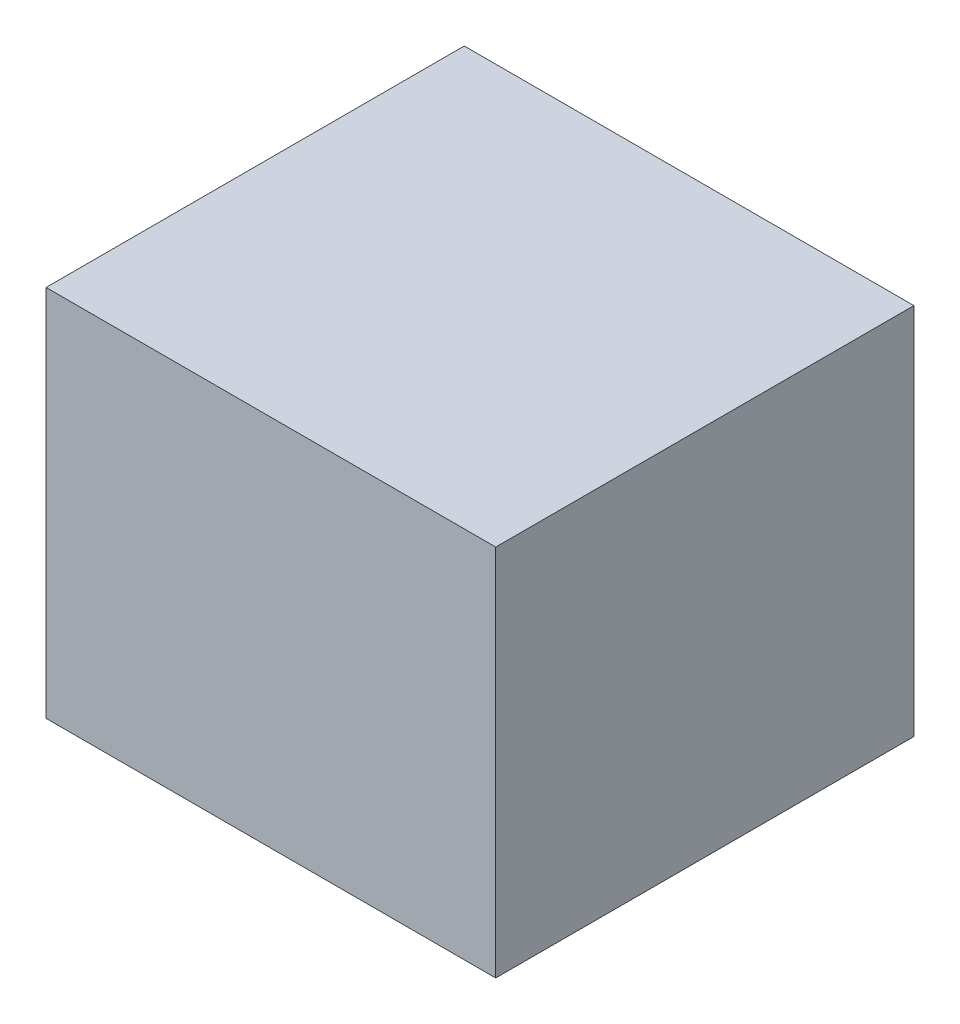
ISO-10303-21;
HEADER;
FILE_DESCRIPTION(('STEP AP214'),'2;1');
FILE_NAME('part.step','',(''),(''),'','','');
FILE_SCHEMA(('AUTOMOTIVE_DESIGN { 1 0 10303 214 1 1 1 1 }'));
ENDSEC;
DATA;
#1=APPLICATION_CONTEXT('core data for automotive mechanical design processes');
#2=APPLICATION_PROTOCOL_DEFINITION('international standard','automotive_design',2000,#1);
#3=PRODUCT_CONTEXT('',#1,'mechanical');
#4=PRODUCT('Part','Part','',(#3));
#5=PRODUCT_RELATED_PRODUCT_CATEGORY('part','',(#4));
#6=PRODUCT_DEFINITION_FORMATION('','',#4);
#7=PRODUCT_DEFINITION_CONTEXT('part definition',#1,'design');
#8=PRODUCT_DEFINITION('design','',#6,#7);
#9=PRODUCT_DEFINITION_SHAPE('','',#8);
#10=(LENGTH_UNIT() NAMED_UNIT(*) SI_UNIT(.MILLI.,.METRE.));
#11=(NAMED_UNIT(*) PLANE_ANGLE_UNIT() SI_UNIT($,.RADIAN.));
#12=(NAMED_UNIT(*) SI_UNIT($,.STERADIAN.) SOLID_ANGLE_UNIT());
#13=UNCERTAINTY_MEASURE_WITH_UNIT(LENGTH_MEASURE(1.E-05),#10,'distance_accuracy_value','');
#14=(GEOMETRIC_REPRESENTATION_CONTEXT(3) GLOBAL_UNCERTAINTY_ASSIGNED_CONTEXT((#13)) GLOBAL_UNIT_ASSIGNED_CONTEXT((#10,
#11,#12)) REPRESENTATION_CONTEXT('',''));
#15=CARTESIAN_POINT('',(0.,0.,0.));
#16=DIRECTION('',(0.,0.,1.));
#17=DIRECTION('',(1.,0.,0.));
#18=AXIS2_PLACEMENT_3D('',#15,#16,#17);
#19=CARTESIAN_POINT('',(99.,-38.5,45.));
#20=DIRECTION('',(0.,1.,0.));
#21=DIRECTION('',(0.,0.,1.));
#22=AXIS2_PLACEMENT_3D('',#19,#20,#21);
#23=PLANE('',#22);
#24=DIRECTION('',(0.,0.,-1.));
#25=VECTOR('',#24,1.);
#26=CARTESIAN_POINT('',(35.5,-38.5,45.));
#27=LINE('',#26,#25);
#28=CARTESIAN_POINT('',(35.5,-38.5,43.5));
#29=VERTEX_POINT('',#28);
#30=CARTESIAN_POINT('',(35.5,-38.5,7.50000000000001));
#31=VERTEX_POINT('',#30);
#32=EDGE_CURVE('E403',#29,#31,#27,.T.);
#33=ORIENTED_EDGE('',*,*,#32,.T.);
#34=DIRECTION('',(0.,0.,-1.));
#35=VECTOR('',#34,1.);
#36=CARTESIAN_POINT('',(35.5,-38.5,45.));
#37=LINE('',#36,#35);
#38=CARTESIAN_POINT('',(35.5,-38.5,-10.5));
#39=VERTEX_POINT('',#38);
#40=EDGE_CURVE('E239',#31,#39,#37,.T.);
#41=ORIENTED_EDGE('',*,*,#40,.T.);
#42=CARTESIAN_POINT('',(35.5,-38.5,-43.5));
#43=VERTEX_POINT('',#42);
#44=EDGE_CURVE('E402',#39,#43,#27,.T.);
#45=ORIENTED_EDGE('',*,*,#44,.T.);
#46=DIRECTION('',(-1.,0.,0.));
#47=VECTOR('',#46,1.);
#48=CARTESIAN_POINT('',(99.,-38.5,-43.5));
#49=LINE('',#48,#47);
#50=CARTESIAN_POINT('',(9.99999999999999,-38.5,-43.5));
#51=VERTEX_POINT('',#50);
#52=EDGE_CURVE('E342',#43,#51,#49,.T.);
#53=ORIENTED_EDGE('',*,*,#52,.T.);
#54=DIRECTION('',(0.,0.,-1.));
#55=VECTOR('',#54,1.);
#56=CARTESIAN_POINT('',(9.99999999999999,-38.5,45.));
#57=LINE('',#56,#55);
#58=CARTESIAN_POINT('',(9.99999999999999,-38.5,43.5));
#59=VERTEX_POINT('',#58);
#60=EDGE_CURVE('E397',#59,#51,#57,.T.);
#61=ORIENTED_EDGE('',*,*,#60,.F.);
#62=DIRECTION('',(-1.,0.,0.));
#63=VECTOR('',#62,1.);
#64=CARTESIAN_POINT('',(99.,-38.5,43.5));
#65=LINE('',#64,#63);
#66=EDGE_CURVE('E346',#29,#59,#65,.T.);
#67=ORIENTED_EDGE('',*,*,#66,.F.);
#68=EDGE_LOOP('',(#33,#41,#45,#53,#61,#67));
#69=FACE_BOUND('',#68,.T.);
#70=ADVANCED_FACE('F37',(#69),#23,.T.);
#71=CARTESIAN_POINT('',(37.5,-40.,43.5));
#72=DIRECTION('',(1.,0.,0.));
#73=DIRECTION('',(0.,0.,-1.));
#74=AXIS2_PLACEMENT_3D('',#71,#72,#73);
#75=PLANE('',#74);
#76=DIRECTION('',(0.,0.,-1.));
#77=VECTOR('',#76,1.);
#78=CARTESIAN_POINT('',(37.5,-38.5,45.));
#79=LINE('',#78,#77);
#80=CARTESIAN_POINT('',(37.5,-38.5,43.5));
#81=VERTEX_POINT('',#80);
#82=CARTESIAN_POINT('',(37.5,-38.5,7.5));
#83=VERTEX_POINT('',#82);
#84=EDGE_CURVE('E400',#81,#83,#79,.T.);
#85=ORIENTED_EDGE('',*,*,#84,.T.);
#86=DIRECTION('',(0.,1.,0.));
#87=VECTOR('',#86,1.);
#88=CARTESIAN_POINT('',(37.5,-40.,7.50000000000001));
#89=LINE('',#88,#87);
#90=CARTESIAN_POINT('',(37.5,38.5,7.50000000000001));
#91=VERTEX_POINT('',#90);
#92=EDGE_CURVE('E60',#83,#91,#89,.T.);
#93=ORIENTED_EDGE('',*,*,#92,.T.);
#94=DIRECTION('',(0.,0.,1.));
#95=VECTOR('',#94,1.);
#96=CARTESIAN_POINT('',(37.5,38.5,45.));
#97=LINE('',#96,#95);
#98=CARTESIAN_POINT('',(37.5,38.5,43.5));
#99=VERTEX_POINT('',#98);
#100=EDGE_CURVE('E255',#91,#99,#97,.T.);
#101=ORIENTED_EDGE('',*,*,#100,.T.);
#102=DIRECTION('',(0.,1.,0.));
#103=VECTOR('',#102,1.);
#104=CARTESIAN_POINT('',(37.5,-40.,43.5));
#105=LINE('',#104,#103);
#106=EDGE_CURVE('E251',#81,#99,#105,.T.);
#107=ORIENTED_EDGE('',*,*,#106,.F.);
#108=EDGE_LOOP('',(#85,#93,#101,#107));
#109=FACE_BOUND('',#108,.T.);
#110=ADVANCED_FACE('F459',(#109),#75,.T.);
#111=CARTESIAN_POINT('',(35.5,-40.,43.5));
#112=DIRECTION('',(1.,0.,0.));
#113=DIRECTION('',(0.,0.,-1.));
#114=AXIS2_PLACEMENT_3D('',#111,#112,#113);
#115=PLANE('',#114);
#116=DIRECTION('',(0.,1.,0.));
#117=VECTOR('',#116,1.);
#118=CARTESIAN_POINT('',(35.5,-40.,7.50000000000001));
#119=LINE('',#118,#117);
#120=CARTESIAN_POINT('',(35.5,38.5,7.50000000000001));
#121=VERTEX_POINT('',#120);
#122=EDGE_CURVE('E45',#31,#121,#119,.T.);
#123=ORIENTED_EDGE('',*,*,#122,.F.);
#124=ORIENTED_EDGE('',*,*,#32,.F.);
#125=DIRECTION('',(0.,1.,0.));
#126=VECTOR('',#125,1.);
#127=CARTESIAN_POINT('',(35.5,-40.,43.5));
#128=LINE('',#127,#126);
#129=CARTESIAN_POINT('',(35.5,38.5,43.5));
#130=VERTEX_POINT('',#129);
#131=EDGE_CURVE('E252',#29,#130,#128,.T.);
#132=ORIENTED_EDGE('',*,*,#131,.T.);
#133=DIRECTION('',(0.,0.,1.));
#134=VECTOR('',#133,1.);
#135=CARTESIAN_POINT('',(35.5,38.5,45.));
#136=LINE('',#135,#134);
#137=EDGE_CURVE('E267',#121,#130,#136,.T.);
#138=ORIENTED_EDGE('',*,*,#137,.F.);
#139=EDGE_LOOP('',(#123,#124,#132,#138));
#140=FACE_BOUND('',#139,.T.);
#141=ADVANCED_FACE('F413',(#140),#115,.F.);
#142=CARTESIAN_POINT('',(99.,40.,-43.5));
#143=DIRECTION('',(0.,0.,1.));
#144=DIRECTION('',(0.,-1.,0.));
#145=AXIS2_PLACEMENT_3D('',#142,#143,#144);
#146=PLANE('',#145);
#147=ORIENTED_EDGE('',*,*,#52,.F.);
#148=DIRECTION('',(0.,1.,0.));
#149=VECTOR('',#148,1.);
#150=CARTESIAN_POINT('',(35.5,-40.,-43.5));
#151=LINE('',#150,#149);
#152=CARTESIAN_POINT('',(35.5,38.5,-43.5));
#153=VERTEX_POINT('',#152);
#154=EDGE_CURVE('E256',#43,#153,#151,.T.);
#155=ORIENTED_EDGE('',*,*,#154,.T.);
#156=DIRECTION('',(-1.,0.,0.));
#157=VECTOR('',#156,1.);
#158=CARTESIAN_POINT('',(99.,38.5,-43.5));
#159=LINE('',#158,#157);
#160=CARTESIAN_POINT('',(9.99999999999999,38.5,-43.5));
#161=VERTEX_POINT('',#160);
#162=EDGE_CURVE('E354',#153,#161,#159,.T.);
#163=ORIENTED_EDGE('',*,*,#162,.T.);
#164=DIRECTION('',(0.,1.,0.));
#165=VECTOR('',#164,1.);
#166=CARTESIAN_POINT('',(9.99999999999999,40.,-43.5));
#167=LINE('',#166,#165);
#168=EDGE_CURVE('E307',#51,#161,#167,.T.);
#169=ORIENTED_EDGE('',*,*,#168,.F.);
#170=EDGE_LOOP('',(#147,#155,#163,#169));
#171=FACE_BOUND('',#170,.T.);
#172=ADVANCED_FACE('F430',(#171),#146,.T.);
#173=CARTESIAN_POINT('',(99.,40.,43.5));
#174=DIRECTION('',(0.,0.,-1.));
#175=DIRECTION('',(0.,1.,0.));
#176=AXIS2_PLACEMENT_3D('',#173,#174,#175);
#177=PLANE('',#176);
#178=DIRECTION('',(-1.,0.,0.));
#179=VECTOR('',#178,1.);
#180=CARTESIAN_POINT('',(99.,38.5,43.5));
#181=LINE('',#180,#179);
#182=CARTESIAN_POINT('',(9.99999999999999,38.5,43.5));
#183=VERTEX_POINT('',#182);
#184=EDGE_CURVE('E350',#130,#183,#181,.T.);
#185=ORIENTED_EDGE('',*,*,#184,.F.);
#186=ORIENTED_EDGE('',*,*,#131,.F.);
#187=ORIENTED_EDGE('',*,*,#66,.T.);
#188=DIRECTION('',(0.,-1.,0.));
#189=VECTOR('',#188,1.);
#190=CARTESIAN_POINT('',(9.99999999999999,40.,43.5));
#191=LINE('',#190,#189);
#192=EDGE_CURVE('E302',#183,#59,#191,.T.);
#193=ORIENTED_EDGE('',*,*,#192,.F.);
#194=EDGE_LOOP('',(#185,#186,#187,#193));
#195=FACE_BOUND('',#194,.T.);
#196=ADVANCED_FACE('F419',(#195),#177,.T.);
#197=CARTESIAN_POINT('',(0.,0.,0.));
#198=DIRECTION('',(1.,0.,0.));
#199=DIRECTION('',(0.,0.,-1.));
#200=AXIS2_PLACEMENT_3D('',#197,#198,#199);
#201=PLANE('',#200);
#202=DIRECTION('',(0.,1.,0.));
#203=VECTOR('',#202,1.);
#204=CARTESIAN_POINT('',(0.,40.,-46.5));
#205=LINE('',#204,#203);
#206=CARTESIAN_POINT('',(0.,-41.5,-46.5));
#207=VERTEX_POINT('',#206);
#208=CARTESIAN_POINT('',(0.,41.5,-46.5));
#209=VERTEX_POINT('',#208);
#210=EDGE_CURVE('E358',#207,#209,#205,.T.);
#211=ORIENTED_EDGE('',*,*,#210,.F.);
#212=DIRECTION('',(0.,0.,-1.));
#213=VECTOR('',#212,1.);
#214=CARTESIAN_POINT('',(0.,-41.5,45.));
#215=LINE('',#214,#213);
#216=CARTESIAN_POINT('',(0.,-41.5,46.5));
#217=VERTEX_POINT('',#216);
#218=EDGE_CURVE('E363',#217,#207,#215,.T.);
#219=ORIENTED_EDGE('',*,*,#218,.F.);
#220=DIRECTION('',(0.,-1.,0.));
#221=VECTOR('',#220,1.);
#222=CARTESIAN_POINT('',(0.,40.,46.5));
#223=LINE('',#222,#221);
#224=CARTESIAN_POINT('',(0.,41.5,46.5));
#225=VERTEX_POINT('',#224);
#226=EDGE_CURVE('E374',#225,#217,#223,.T.);
#227=ORIENTED_EDGE('',*,*,#226,.F.);
#228=DIRECTION('',(0.,0.,1.));
#229=VECTOR('',#228,1.);
#230=CARTESIAN_POINT('',(0.,41.5,45.));
#231=LINE('',#230,#229);
#232=EDGE_CURVE('E372',#209,#225,#231,.T.);
#233=ORIENTED_EDGE('',*,*,#232,.F.);
#234=EDGE_LOOP('',(#211,#219,#227,#233));
#235=FACE_BOUND('',#234,.T.);
#236=DIRECTION('',(0.,1.,0.));
#237=VECTOR('',#236,1.);
#238=CARTESIAN_POINT('',(0.,40.,-45.));
#239=LINE('',#238,#237);
#240=CARTESIAN_POINT('',(0.,-40.,-45.));
#241=VERTEX_POINT('',#240);
#242=CARTESIAN_POINT('',(0.,40.,-45.));
#243=VERTEX_POINT('',#242);
#244=EDGE_CURVE('E271',#241,#243,#239,.T.);
#245=ORIENTED_EDGE('',*,*,#244,.T.);
#246=DIRECTION('',(0.,0.,1.));
#247=VECTOR('',#246,1.);
#248=CARTESIAN_POINT('',(0.,40.,45.));
#249=LINE('',#248,#247);
#250=CARTESIAN_POINT('',(0.,40.,45.));
#251=VERTEX_POINT('',#250);
#252=EDGE_CURVE('E285',#243,#251,#249,.T.);
#253=ORIENTED_EDGE('',*,*,#252,.T.);
#254=DIRECTION('',(0.,-1.,0.));
#255=VECTOR('',#254,1.);
#256=CARTESIAN_POINT('',(0.,40.,45.));
#257=LINE('',#256,#255);
#258=CARTESIAN_POINT('',(0.,-40.,45.));
#259=VERTEX_POINT('',#258);
#260=EDGE_CURVE('E288',#251,#259,#257,.T.);
#261=ORIENTED_EDGE('',*,*,#260,.T.);
#262=DIRECTION('',(0.,0.,-1.));
#263=VECTOR('',#262,1.);
#264=CARTESIAN_POINT('',(0.,-40.,45.));
#265=LINE('',#264,#263);
#266=EDGE_CURVE('E276',#259,#241,#265,.T.);
#267=ORIENTED_EDGE('',*,*,#266,.T.);
#268=EDGE_LOOP('',(#245,#253,#261,#267));
#269=FACE_BOUND('',#268,.T.);
#270=ADVANCED_FACE('F524',(#235,#269),#201,.F.);
#271=CARTESIAN_POINT('',(100.,40.,-46.5));
#272=DIRECTION('',(0.,0.,1.));
#273=DIRECTION('',(0.,-1.,0.));
#274=AXIS2_PLACEMENT_3D('',#271,#272,#273);
#275=PLANE('',#274);
#276=DIRECTION('',(1.,0.,0.));
#277=VECTOR('',#276,1.);
#278=CARTESIAN_POINT('',(88.2,-28.5,-46.5));
#279=LINE('',#278,#277);
#280=CARTESIAN_POINT('',(88.2,-28.5,-46.5));
#281=VERTEX_POINT('',#280);
#282=CARTESIAN_POINT('',(97.,-28.5,-46.5));
#283=VERTEX_POINT('',#282);
#284=EDGE_CURVE('E319',#281,#283,#279,.T.);
#285=ORIENTED_EDGE('',*,*,#284,.T.);
#286=DIRECTION('',(0.,1.,0.));
#287=VECTOR('',#286,1.);
#288=CARTESIAN_POINT('',(97.,31.5,-46.5));
#289=LINE('',#288,#287);
#290=CARTESIAN_POINT('',(97.,31.5,-46.5));
#291=VERTEX_POINT('',#290);
#292=EDGE_CURVE('E310',#283,#291,#289,.T.);
#293=ORIENTED_EDGE('',*,*,#292,.T.);
#294=DIRECTION('',(-1.,0.,0.));
#295=VECTOR('',#294,1.);
#296=CARTESIAN_POINT('',(88.2,31.5,-46.5));
#297=LINE('',#296,#295);
#298=CARTESIAN_POINT('',(88.2,31.5,-46.5));
#299=VERTEX_POINT('',#298);
#300=EDGE_CURVE('E313',#291,#299,#297,.T.);
#301=ORIENTED_EDGE('',*,*,#300,.T.);
#302=DIRECTION('',(0.,-1.,0.));
#303=VECTOR('',#302,1.);
#304=CARTESIAN_POINT('',(88.2,31.5,-46.5));
#305=LINE('',#304,#303);
#306=EDGE_CURVE('E316',#299,#281,#305,.T.);
#307=ORIENTED_EDGE('',*,*,#306,.T.);
#308=EDGE_LOOP('',(#285,#293,#301,#307));
#309=FACE_BOUND('',#308,.T.);
#310=ORIENTED_EDGE('',*,*,#210,.T.);
#311=DIRECTION('',(-1.,0.,0.));
#312=VECTOR('',#311,1.);
#313=CARTESIAN_POINT('',(100.,41.5,-46.5));
#314=LINE('',#313,#312);
#315=CARTESIAN_POINT('',(100.,41.5,-46.5));
#316=VERTEX_POINT('',#315);
#317=EDGE_CURVE('E385',#316,#209,#314,.T.);
#318=ORIENTED_EDGE('',*,*,#317,.F.);
#319=DIRECTION('',(0.,1.,0.));
#320=VECTOR('',#319,1.);
#321=CARTESIAN_POINT('',(100.,40.,-46.5));
#322=LINE('',#321,#320);
#323=CARTESIAN_POINT('',(100.,-41.5,-46.5));
#324=VERTEX_POINT('',#323);
#325=EDGE_CURVE('E359',#324,#316,#322,.T.);
#326=ORIENTED_EDGE('',*,*,#325,.F.);
#327=DIRECTION('',(-1.,0.,0.));
#328=VECTOR('',#327,1.);
#329=CARTESIAN_POINT('',(100.,-41.5,-46.5));
#330=LINE('',#329,#328);
#331=EDGE_CURVE('E369',#324,#207,#330,.T.);
#332=ORIENTED_EDGE('',*,*,#331,.T.);
#333=EDGE_LOOP('',(#310,#318,#326,#332));
#334=FACE_BOUND('',#333,.T.);
#335=ADVANCED_FACE('F39',(#309,#334),#275,.F.);
#336=CARTESIAN_POINT('',(100.,41.5,45.));
#337=DIRECTION('',(0.,-1.,0.));
#338=DIRECTION('',(0.,0.,-1.));
#339=AXIS2_PLACEMENT_3D('',#336,#337,#338);
#340=PLANE('',#339);
#341=ORIENTED_EDGE('',*,*,#232,.T.);
#342=DIRECTION('',(-1.,0.,0.));
#343=VECTOR('',#342,1.);
#344=CARTESIAN_POINT('',(100.,41.5,46.5));
#345=LINE('',#344,#343);
#346=CARTESIAN_POINT('',(100.,41.5,46.5));
#347=VERTEX_POINT('',#346);
#348=EDGE_CURVE('E382',#347,#225,#345,.T.);
#349=ORIENTED_EDGE('',*,*,#348,.F.);
#350=DIRECTION('',(0.,0.,1.));
#351=VECTOR('',#350,1.);
#352=CARTESIAN_POINT('',(100.,41.5,45.));
#353=LINE('',#352,#351);
#354=EDGE_CURVE('E362',#316,#347,#353,.T.);
#355=ORIENTED_EDGE('',*,*,#354,.F.);
#356=ORIENTED_EDGE('',*,*,#317,.T.);
#357=EDGE_LOOP('',(#341,#349,#355,#356));
#358=FACE_BOUND('',#357,.T.);
#359=ADVANCED_FACE('F532',(#358),#340,.F.);
#360=CARTESIAN_POINT('',(100.,40.,46.5));
#361=DIRECTION('',(0.,0.,-1.));
#362=DIRECTION('',(0.,1.,0.));
#363=AXIS2_PLACEMENT_3D('',#360,#361,#362);
#364=PLANE('',#363);
#365=ORIENTED_EDGE('',*,*,#226,.T.);
#366=DIRECTION('',(-1.,0.,0.));
#367=VECTOR('',#366,1.);
#368=CARTESIAN_POINT('',(100.,-41.5,46.5));
#369=LINE('',#368,#367);
#370=CARTESIAN_POINT('',(100.,-41.5,46.5));
#371=VERTEX_POINT('',#370);
#372=EDGE_CURVE('E379',#371,#217,#369,.T.);
#373=ORIENTED_EDGE('',*,*,#372,.F.);
#374=DIRECTION('',(0.,-1.,0.));
#375=VECTOR('',#374,1.);
#376=CARTESIAN_POINT('',(100.,40.,46.5));
#377=LINE('',#376,#375);
#378=EDGE_CURVE('E365',#347,#371,#377,.T.);
#379=ORIENTED_EDGE('',*,*,#378,.F.);
#380=ORIENTED_EDGE('',*,*,#348,.T.);
#381=EDGE_LOOP('',(#365,#373,#379,#380));
#382=FACE_BOUND('',#381,.T.);
#383=ADVANCED_FACE('F530',(#382),#364,.F.);
#384=CARTESIAN_POINT('',(100.,-41.5,45.));
#385=DIRECTION('',(0.,1.,0.));
#386=DIRECTION('',(0.,0.,1.));
#387=AXIS2_PLACEMENT_3D('',#384,#385,#386);
#388=PLANE('',#387);
#389=DIRECTION('',(0.,0.,-1.));
#390=VECTOR('',#389,1.);
#391=CARTESIAN_POINT('',(35.5,-41.5,0.));
#392=LINE('',#391,#390);
#393=CARTESIAN_POINT('',(35.5,-41.5,7.50000000000001));
#394=VERTEX_POINT('',#393);
#395=CARTESIAN_POINT('',(35.5,-41.5,-10.5));
#396=VERTEX_POINT('',#395);
#397=EDGE_CURVE('E217',#394,#396,#392,.T.);
#398=ORIENTED_EDGE('',*,*,#397,.F.);
#399=DIRECTION('',(1.,0.,0.));
#400=VECTOR('',#399,1.);
#401=CARTESIAN_POINT('',(0.,-41.5,7.50000000000001));
#402=LINE('',#401,#400);
#403=CARTESIAN_POINT('',(37.5,-41.5,7.50000000000001));
#404=VERTEX_POINT('',#403);
#405=EDGE_CURVE('E214',#394,#404,#402,.T.);
#406=ORIENTED_EDGE('',*,*,#405,.T.);
#407=DIRECTION('',(0.,0.,-1.));
#408=VECTOR('',#407,1.);
#409=CARTESIAN_POINT('',(37.5,-41.5,0.));
#410=LINE('',#409,#408);
#411=CARTESIAN_POINT('',(37.5,-41.5,-10.5));
#412=VERTEX_POINT('',#411);
#413=EDGE_CURVE('E220',#404,#412,#410,.T.);
#414=ORIENTED_EDGE('',*,*,#413,.T.);
#415=DIRECTION('',(1.,0.,0.));
#416=VECTOR('',#415,1.);
#417=CARTESIAN_POINT('',(0.,-41.5,-10.5));
#418=LINE('',#417,#416);
#419=EDGE_CURVE('E224',#396,#412,#418,.T.);
#420=ORIENTED_EDGE('',*,*,#419,.F.);
#421=EDGE_LOOP('',(#398,#406,#414,#420));
#422=FACE_BOUND('',#421,.T.);
#423=ORIENTED_EDGE('',*,*,#218,.T.);
#424=ORIENTED_EDGE('',*,*,#331,.F.);
#425=DIRECTION('',(0.,0.,-1.));
#426=VECTOR('',#425,1.);
#427=CARTESIAN_POINT('',(100.,-41.5,45.));
#428=LINE('',#427,#426);
#429=EDGE_CURVE('E367',#371,#324,#428,.T.);
#430=ORIENTED_EDGE('',*,*,#429,.F.);
#431=ORIENTED_EDGE('',*,*,#372,.T.);
#432=EDGE_LOOP('',(#423,#424,#430,#431));
#433=FACE_BOUND('',#432,.T.);
#434=ADVANCED_FACE('F226',(#422,#433),#388,.F.);
#435=CARTESIAN_POINT('',(100.,0.,0.));
#436=DIRECTION('',(1.,0.,0.));
#437=DIRECTION('',(0.,0.,-1.));
#438=AXIS2_PLACEMENT_3D('',#435,#436,#437);
#439=PLANE('',#438);
#440=ORIENTED_EDGE('',*,*,#325,.T.);
#441=ORIENTED_EDGE('',*,*,#354,.T.);
#442=ORIENTED_EDGE('',*,*,#378,.T.);
#443=ORIENTED_EDGE('',*,*,#429,.T.);
#444=EDGE_LOOP('',(#440,#441,#442,#443));
#445=FACE_BOUND('',#444,.T.);
#446=ADVANCED_FACE('F510',(#445),#439,.T.);
#447=CARTESIAN_POINT('',(97.,31.5,-46.5));
#448=DIRECTION('',(1.,0.,0.));
#449=DIRECTION('',(0.,0.,-1.));
#450=AXIS2_PLACEMENT_3D('',#447,#448,#449);
#451=PLANE('',#450);
#452=DIRECTION('',(0.,1.,0.));
#453=VECTOR('',#452,1.);
#454=CARTESIAN_POINT('',(97.,40.,-43.5));
#455=LINE('',#454,#453);
#456=CARTESIAN_POINT('',(97.,-28.5,-43.5));
#457=VERTEX_POINT('',#456);
#458=CARTESIAN_POINT('',(97.,31.5,-43.5));
#459=VERTEX_POINT('',#458);
#460=EDGE_CURVE('E394',#457,#459,#455,.T.);
#461=ORIENTED_EDGE('',*,*,#460,.T.);
#462=DIRECTION('',(0.,0.,1.));
#463=VECTOR('',#462,1.);
#464=CARTESIAN_POINT('',(97.,31.5,-46.5));
#465=LINE('',#464,#463);
#466=EDGE_CURVE('E322',#291,#459,#465,.T.);
#467=ORIENTED_EDGE('',*,*,#466,.F.);
#468=ORIENTED_EDGE('',*,*,#292,.F.);
#469=DIRECTION('',(0.,0.,1.));
#470=VECTOR('',#469,1.);
#471=CARTESIAN_POINT('',(97.,-28.5,-46.5));
#472=LINE('',#471,#470);
#473=EDGE_CURVE('E323',#283,#457,#472,.T.);
#474=ORIENTED_EDGE('',*,*,#473,.T.);
#475=EDGE_LOOP('',(#461,#467,#468,#474));
#476=FACE_BOUND('',#475,.T.);
#477=ADVANCED_FACE('F499',(#476),#451,.F.);
#478=CARTESIAN_POINT('',(88.2,-28.5,-46.5));
#479=DIRECTION('',(0.,-1.,0.));
#480=DIRECTION('',(0.,0.,-1.));
#481=AXIS2_PLACEMENT_3D('',#478,#479,#480);
#482=PLANE('',#481);
#483=DIRECTION('',(1.,0.,0.));
#484=VECTOR('',#483,1.);
#485=CARTESIAN_POINT('',(99.,-28.5,-43.5));
#486=LINE('',#485,#484);
#487=CARTESIAN_POINT('',(88.2,-28.5,-43.5));
#488=VERTEX_POINT('',#487);
#489=EDGE_CURVE('E392',#488,#457,#486,.T.);
#490=ORIENTED_EDGE('',*,*,#489,.T.);
#491=ORIENTED_EDGE('',*,*,#473,.F.);
#492=ORIENTED_EDGE('',*,*,#284,.F.);
#493=DIRECTION('',(0.,0.,1.));
#494=VECTOR('',#493,1.);
#495=CARTESIAN_POINT('',(88.2,-28.5,-46.5));
#496=LINE('',#495,#494);
#497=EDGE_CURVE('E327',#281,#488,#496,.T.);
#498=ORIENTED_EDGE('',*,*,#497,.T.);
#499=EDGE_LOOP('',(#490,#491,#492,#498));
#500=FACE_BOUND('',#499,.T.);
#501=ADVANCED_FACE('F495',(#500),#482,.F.);
#502=CARTESIAN_POINT('',(88.2,31.5,-46.5));
#503=DIRECTION('',(-1.,0.,0.));
#504=DIRECTION('',(0.,-1.,0.));
#505=AXIS2_PLACEMENT_3D('',#502,#503,#504);
#506=PLANE('',#505);
#507=DIRECTION('',(0.,-1.,0.));
#508=VECTOR('',#507,1.);
#509=CARTESIAN_POINT('',(88.2,40.,-43.5));
#510=LINE('',#509,#508);
#511=CARTESIAN_POINT('',(88.2,31.5,-43.5));
#512=VERTEX_POINT('',#511);
#513=EDGE_CURVE('E390',#512,#488,#510,.T.);
#514=ORIENTED_EDGE('',*,*,#513,.T.);
#515=ORIENTED_EDGE('',*,*,#497,.F.);
#516=ORIENTED_EDGE('',*,*,#306,.F.);
#517=DIRECTION('',(0.,0.,1.));
#518=VECTOR('',#517,1.);
#519=CARTESIAN_POINT('',(88.2,31.5,-46.5));
#520=LINE('',#519,#518);
#521=EDGE_CURVE('E330',#299,#512,#520,.T.);
#522=ORIENTED_EDGE('',*,*,#521,.T.);
#523=EDGE_LOOP('',(#514,#515,#516,#522));
#524=FACE_BOUND('',#523,.T.);
#525=ADVANCED_FACE('F498',(#524),#506,.F.);
#526=CARTESIAN_POINT('',(88.2,31.5,-46.5));
#527=DIRECTION('',(0.,1.,0.));
#528=DIRECTION('',(0.,0.,1.));
#529=AXIS2_PLACEMENT_3D('',#526,#527,#528);
#530=PLANE('',#529);
#531=DIRECTION('',(-1.,0.,0.));
#532=VECTOR('',#531,1.);
#533=CARTESIAN_POINT('',(99.,31.5,-43.5));
#534=LINE('',#533,#532);
#535=EDGE_CURVE('E388',#459,#512,#534,.T.);
#536=ORIENTED_EDGE('',*,*,#535,.T.);
#537=ORIENTED_EDGE('',*,*,#521,.F.);
#538=ORIENTED_EDGE('',*,*,#300,.F.);
#539=ORIENTED_EDGE('',*,*,#466,.T.);
#540=EDGE_LOOP('',(#536,#537,#538,#539));
#541=FACE_BOUND('',#540,.T.);
#542=ADVANCED_FACE('F503',(#541),#530,.F.);
#543=DIRECTION('',(0.,1.,0.));
#544=VECTOR('',#543,1.);
#545=CARTESIAN_POINT('',(37.5,-40.,-43.5));
#546=LINE('',#545,#544);
#547=CARTESIAN_POINT('',(37.5,-38.5,-43.5));
#548=VERTEX_POINT('',#547);
#549=CARTESIAN_POINT('',(37.5,38.5,-43.5));
#550=VERTEX_POINT('',#549);
#551=EDGE_CURVE('E259',#548,#550,#546,.T.);
#552=ORIENTED_EDGE('',*,*,#551,.F.);
#553=CARTESIAN_POINT('',(99.,-38.5,-43.5));
#554=VERTEX_POINT('',#553);
#555=EDGE_CURVE('E343',#554,#548,#49,.T.);
#556=ORIENTED_EDGE('',*,*,#555,.F.);
#557=DIRECTION('',(0.,1.,0.));
#558=VECTOR('',#557,1.);
#559=CARTESIAN_POINT('',(99.,40.,-43.5));
#560=LINE('',#559,#558);
#561=CARTESIAN_POINT('',(99.,38.5,-43.5));
#562=VERTEX_POINT('',#561);
#563=EDGE_CURVE('E326',#554,#562,#560,.T.);
#564=ORIENTED_EDGE('',*,*,#563,.T.);
#565=EDGE_CURVE('E355',#562,#550,#159,.T.);
#566=ORIENTED_EDGE('',*,*,#565,.T.);
#567=EDGE_LOOP('',(#552,#556,#564,#566));
#568=FACE_BOUND('',#567,.T.);
#569=ORIENTED_EDGE('',*,*,#460,.F.);
#570=ORIENTED_EDGE('',*,*,#489,.F.);
#571=ORIENTED_EDGE('',*,*,#513,.F.);
#572=ORIENTED_EDGE('',*,*,#535,.F.);
#573=EDGE_LOOP('',(#569,#570,#571,#572));
#574=FACE_BOUND('',#573,.T.);
#575=ADVANCED_FACE('F445',(#568,#574),#146,.T.);
#576=CARTESIAN_POINT('',(99.,38.5,45.));
#577=DIRECTION('',(0.,-1.,0.));
#578=DIRECTION('',(0.,0.,-1.));
#579=AXIS2_PLACEMENT_3D('',#576,#577,#578);
#580=PLANE('',#579);
#581=DIRECTION('',(-1.,0.,0.));
#582=VECTOR('',#581,1.);
#583=CARTESIAN_POINT('',(55.9999999999999,38.5,-10.5));
#584=LINE('',#583,#582);
#585=CARTESIAN_POINT('',(37.5,38.5,-10.5));
#586=VERTEX_POINT('',#585);
#587=CARTESIAN_POINT('',(35.5,38.5,-10.5));
#588=VERTEX_POINT('',#587);
#589=EDGE_CURVE('E243',#586,#588,#584,.T.);
#590=ORIENTED_EDGE('',*,*,#589,.F.);
#591=EDGE_CURVE('E264',#550,#586,#97,.T.);
#592=ORIENTED_EDGE('',*,*,#591,.F.);
#593=ORIENTED_EDGE('',*,*,#565,.F.);
#594=DIRECTION('',(0.,0.,1.));
#595=VECTOR('',#594,1.);
#596=CARTESIAN_POINT('',(99.,38.5,45.));
#597=LINE('',#596,#595);
#598=CARTESIAN_POINT('',(99.,38.5,43.5));
#599=VERTEX_POINT('',#598);
#600=EDGE_CURVE('E336',#562,#599,#597,.T.);
#601=ORIENTED_EDGE('',*,*,#600,.T.);
#602=EDGE_CURVE('E351',#599,#99,#181,.T.);
#603=ORIENTED_EDGE('',*,*,#602,.T.);
#604=ORIENTED_EDGE('',*,*,#100,.F.);
#605=DIRECTION('',(-1.,0.,0.));
#606=VECTOR('',#605,1.);
#607=CARTESIAN_POINT('',(55.9999999999999,38.5,7.50000000000001));
#608=LINE('',#607,#606);
#609=EDGE_CURVE('E242',#91,#121,#608,.T.);
#610=ORIENTED_EDGE('',*,*,#609,.T.);
#611=ORIENTED_EDGE('',*,*,#137,.T.);
#612=ORIENTED_EDGE('',*,*,#184,.T.);
#613=DIRECTION('',(0.,0.,1.));
#614=VECTOR('',#613,1.);
#615=CARTESIAN_POINT('',(9.99999999999999,38.5,45.));
#616=LINE('',#615,#614);
#617=EDGE_CURVE('E305',#161,#183,#616,.T.);
#618=ORIENTED_EDGE('',*,*,#617,.F.);
#619=ORIENTED_EDGE('',*,*,#162,.F.);
#620=EDGE_CURVE('E268',#153,#588,#136,.T.);
#621=ORIENTED_EDGE('',*,*,#620,.T.);
#622=EDGE_LOOP('',(#590,#592,#593,#601,#603,#604,#610,#611,#612,#618,#619,#621));
#623=FACE_BOUND('',#622,.T.);
#624=ADVANCED_FACE('F411',(#623),#580,.T.);
#625=ORIENTED_EDGE('',*,*,#106,.T.);
#626=ORIENTED_EDGE('',*,*,#602,.F.);
#627=DIRECTION('',(0.,-1.,0.));
#628=VECTOR('',#627,1.);
#629=CARTESIAN_POINT('',(99.,40.,43.5));
#630=LINE('',#629,#628);
#631=CARTESIAN_POINT('',(99.,-38.5,43.5));
#632=VERTEX_POINT('',#631);
#633=EDGE_CURVE('E338',#599,#632,#630,.T.);
#634=ORIENTED_EDGE('',*,*,#633,.T.);
#635=EDGE_CURVE('E347',#632,#81,#65,.T.);
#636=ORIENTED_EDGE('',*,*,#635,.T.);
#637=EDGE_LOOP('',(#625,#626,#634,#636));
#638=FACE_BOUND('',#637,.T.);
#639=ADVANCED_FACE('F452',(#638),#177,.T.);
#640=DIRECTION('',(0.,0.,-1.));
#641=VECTOR('',#640,1.);
#642=CARTESIAN_POINT('',(37.5,-38.5,45.));
#643=LINE('',#642,#641);
#644=CARTESIAN_POINT('',(37.5,-38.5,-10.5));
#645=VERTEX_POINT('',#644);
#646=EDGE_CURVE('E234',#83,#645,#643,.T.);
#647=ORIENTED_EDGE('',*,*,#646,.F.);
#648=ORIENTED_EDGE('',*,*,#84,.F.);
#649=ORIENTED_EDGE('',*,*,#635,.F.);
#650=DIRECTION('',(0.,0.,-1.));
#651=VECTOR('',#650,1.);
#652=CARTESIAN_POINT('',(99.,-38.5,45.));
#653=LINE('',#652,#651);
#654=EDGE_CURVE('E340',#632,#554,#653,.T.);
#655=ORIENTED_EDGE('',*,*,#654,.T.);
#656=ORIENTED_EDGE('',*,*,#555,.T.);
#657=EDGE_CURVE('E399',#645,#548,#79,.T.);
#658=ORIENTED_EDGE('',*,*,#657,.F.);
#659=EDGE_LOOP('',(#647,#648,#649,#655,#656,#658));
#660=FACE_BOUND('',#659,.T.);
#661=ADVANCED_FACE('F458',(#660),#23,.T.);
#662=CARTESIAN_POINT('',(99.,0.,0.));
#663=DIRECTION('',(1.,0.,0.));
#664=DIRECTION('',(0.,0.,-1.));
#665=AXIS2_PLACEMENT_3D('',#662,#663,#664);
#666=PLANE('',#665);
#667=ORIENTED_EDGE('',*,*,#563,.F.);
#668=ORIENTED_EDGE('',*,*,#654,.F.);
#669=ORIENTED_EDGE('',*,*,#633,.F.);
#670=ORIENTED_EDGE('',*,*,#600,.F.);
#671=EDGE_LOOP('',(#667,#668,#669,#670));
#672=FACE_BOUND('',#671,.T.);
#673=ADVANCED_FACE('F456',(#672),#666,.F.);
#674=CARTESIAN_POINT('',(10.,40.,-45.));
#675=DIRECTION('',(0.,0.,1.));
#676=DIRECTION('',(0.,-1.,0.));
#677=AXIS2_PLACEMENT_3D('',#674,#675,#676);
#678=PLANE('',#677);
#679=ORIENTED_EDGE('',*,*,#244,.F.);
#680=DIRECTION('',(-1.,0.,0.));
#681=VECTOR('',#680,1.);
#682=CARTESIAN_POINT('',(10.,-40.,-45.));
#683=LINE('',#682,#681);
#684=CARTESIAN_POINT('',(10.,-40.,-45.));
#685=VERTEX_POINT('',#684);
#686=EDGE_CURVE('E282',#685,#241,#683,.T.);
#687=ORIENTED_EDGE('',*,*,#686,.F.);
#688=DIRECTION('',(0.,1.,0.));
#689=VECTOR('',#688,1.);
#690=CARTESIAN_POINT('',(10.,40.,-45.));
#691=LINE('',#690,#689);
#692=CARTESIAN_POINT('',(10.,40.,-45.));
#693=VERTEX_POINT('',#692);
#694=EDGE_CURVE('E272',#685,#693,#691,.T.);
#695=ORIENTED_EDGE('',*,*,#694,.T.);
#696=DIRECTION('',(-1.,0.,0.));
#697=VECTOR('',#696,1.);
#698=CARTESIAN_POINT('',(10.,40.,-45.));
#699=LINE('',#698,#697);
#700=EDGE_CURVE('E299',#693,#243,#699,.T.);
#701=ORIENTED_EDGE('',*,*,#700,.T.);
#702=EDGE_LOOP('',(#679,#687,#695,#701));
#703=FACE_BOUND('',#702,.T.);
#704=ADVANCED_FACE('F490',(#703),#678,.T.);
#705=CARTESIAN_POINT('',(10.,40.,45.));
#706=DIRECTION('',(0.,-1.,0.));
#707=DIRECTION('',(0.,0.,-1.));
#708=AXIS2_PLACEMENT_3D('',#705,#706,#707);
#709=PLANE('',#708);
#710=ORIENTED_EDGE('',*,*,#252,.F.);
#711=ORIENTED_EDGE('',*,*,#700,.F.);
#712=DIRECTION('',(0.,0.,1.));
#713=VECTOR('',#712,1.);
#714=CARTESIAN_POINT('',(10.,40.,45.));
#715=LINE('',#714,#713);
#716=CARTESIAN_POINT('',(10.,40.,45.));
#717=VERTEX_POINT('',#716);
#718=EDGE_CURVE('E275',#693,#717,#715,.T.);
#719=ORIENTED_EDGE('',*,*,#718,.T.);
#720=DIRECTION('',(-1.,0.,0.));
#721=VECTOR('',#720,1.);
#722=CARTESIAN_POINT('',(10.,40.,45.));
#723=LINE('',#722,#721);
#724=EDGE_CURVE('E297',#717,#251,#723,.T.);
#725=ORIENTED_EDGE('',*,*,#724,.T.);
#726=EDGE_LOOP('',(#710,#711,#719,#725));
#727=FACE_BOUND('',#726,.T.);
#728=ADVANCED_FACE('F486',(#727),#709,.T.);
#729=CARTESIAN_POINT('',(10.,40.,45.));
#730=DIRECTION('',(0.,0.,-1.));
#731=DIRECTION('',(0.,1.,0.));
#732=AXIS2_PLACEMENT_3D('',#729,#730,#731);
#733=PLANE('',#732);
#734=ORIENTED_EDGE('',*,*,#260,.F.);
#735=ORIENTED_EDGE('',*,*,#724,.F.);
#736=DIRECTION('',(0.,-1.,0.));
#737=VECTOR('',#736,1.);
#738=CARTESIAN_POINT('',(10.,40.,45.));
#739=LINE('',#738,#737);
#740=CARTESIAN_POINT('',(10.,-40.,45.));
#741=VERTEX_POINT('',#740);
#742=EDGE_CURVE('E278',#717,#741,#739,.T.);
#743=ORIENTED_EDGE('',*,*,#742,.T.);
#744=DIRECTION('',(-1.,0.,0.));
#745=VECTOR('',#744,1.);
#746=CARTESIAN_POINT('',(10.,-40.,45.));
#747=LINE('',#746,#745);
#748=EDGE_CURVE('E295',#741,#259,#747,.T.);
#749=ORIENTED_EDGE('',*,*,#748,.T.);
#750=EDGE_LOOP('',(#734,#735,#743,#749));
#751=FACE_BOUND('',#750,.T.);
#752=ADVANCED_FACE('F480',(#751),#733,.T.);
#753=CARTESIAN_POINT('',(10.,-40.,45.));
#754=DIRECTION('',(0.,1.,0.));
#755=DIRECTION('',(0.,0.,1.));
#756=AXIS2_PLACEMENT_3D('',#753,#754,#755);
#757=PLANE('',#756);
#758=ORIENTED_EDGE('',*,*,#266,.F.);
#759=ORIENTED_EDGE('',*,*,#748,.F.);
#760=DIRECTION('',(0.,0.,-1.));
#761=VECTOR('',#760,1.);
#762=CARTESIAN_POINT('',(10.,-40.,45.));
#763=LINE('',#762,#761);
#764=EDGE_CURVE('E280',#741,#685,#763,.T.);
#765=ORIENTED_EDGE('',*,*,#764,.T.);
#766=ORIENTED_EDGE('',*,*,#686,.T.);
#767=EDGE_LOOP('',(#758,#759,#765,#766));
#768=FACE_BOUND('',#767,.T.);
#769=ADVANCED_FACE('F476',(#768),#757,.T.);
#770=CARTESIAN_POINT('',(10.,0.,0.));
#771=DIRECTION('',(1.,0.,0.));
#772=DIRECTION('',(0.,0.,-1.));
#773=AXIS2_PLACEMENT_3D('',#770,#771,#772);
#774=PLANE('',#773);
#775=ORIENTED_EDGE('',*,*,#168,.T.);
#776=ORIENTED_EDGE('',*,*,#617,.T.);
#777=ORIENTED_EDGE('',*,*,#192,.T.);
#778=ORIENTED_EDGE('',*,*,#60,.T.);
#779=EDGE_LOOP('',(#775,#776,#777,#778));
#780=FACE_BOUND('',#779,.T.);
#781=ORIENTED_EDGE('',*,*,#694,.F.);
#782=ORIENTED_EDGE('',*,*,#764,.F.);
#783=ORIENTED_EDGE('',*,*,#742,.F.);
#784=ORIENTED_EDGE('',*,*,#718,.F.);
#785=EDGE_LOOP('',(#781,#782,#783,#784));
#786=FACE_BOUND('',#785,.T.);
#787=ADVANCED_FACE('F423',(#780,#786),#774,.F.);
#788=DIRECTION('',(0.,1.,0.));
#789=VECTOR('',#788,1.);
#790=CARTESIAN_POINT('',(37.5,-40.,-10.5));
#791=LINE('',#790,#789);
#792=EDGE_CURVE('E249',#645,#586,#791,.T.);
#793=ORIENTED_EDGE('',*,*,#792,.F.);
#794=ORIENTED_EDGE('',*,*,#657,.T.);
#795=ORIENTED_EDGE('',*,*,#551,.T.);
#796=ORIENTED_EDGE('',*,*,#591,.T.);
#797=EDGE_LOOP('',(#793,#794,#795,#796));
#798=FACE_BOUND('',#797,.T.);
#799=ADVANCED_FACE('F440',(#798),#75,.T.);
#800=ORIENTED_EDGE('',*,*,#44,.F.);
#801=DIRECTION('',(0.,1.,0.));
#802=VECTOR('',#801,1.);
#803=CARTESIAN_POINT('',(35.5,-40.,-10.5));
#804=LINE('',#803,#802);
#805=EDGE_CURVE('E11',#39,#588,#804,.T.);
#806=ORIENTED_EDGE('',*,*,#805,.T.);
#807=ORIENTED_EDGE('',*,*,#620,.F.);
#808=ORIENTED_EDGE('',*,*,#154,.F.);
#809=EDGE_LOOP('',(#800,#806,#807,#808));
#810=FACE_BOUND('',#809,.T.);
#811=ADVANCED_FACE('F434',(#810),#115,.F.);
#812=CARTESIAN_POINT('',(55.9999999999999,38.5,-10.5));
#813=DIRECTION('',(0.,0.,-1.));
#814=DIRECTION('',(0.,1.,0.));
#815=AXIS2_PLACEMENT_3D('',#812,#813,#814);
#816=PLANE('',#815);
#817=ORIENTED_EDGE('',*,*,#589,.T.);
#818=ORIENTED_EDGE('',*,*,#805,.F.);
#819=DIRECTION('',(0.,1.,0.));
#820=VECTOR('',#819,1.);
#821=CARTESIAN_POINT('',(35.5,-41.5,-10.5));
#822=LINE('',#821,#820);
#823=EDGE_CURVE('E235',#396,#39,#822,.T.);
#824=ORIENTED_EDGE('',*,*,#823,.F.);
#825=ORIENTED_EDGE('',*,*,#419,.T.);
#826=DIRECTION('',(0.,1.,0.));
#827=VECTOR('',#826,1.);
#828=CARTESIAN_POINT('',(37.5,-41.5,-10.5));
#829=LINE('',#828,#827);
#830=EDGE_CURVE('E52',#412,#645,#829,.T.);
#831=ORIENTED_EDGE('',*,*,#830,.T.);
#832=ORIENTED_EDGE('',*,*,#792,.T.);
#833=EDGE_LOOP('',(#817,#818,#824,#825,#831,#832));
#834=FACE_BOUND('',#833,.T.);
#835=ADVANCED_FACE('F475',(#834),#816,.F.);
#836=CARTESIAN_POINT('',(55.9999999999999,38.5,7.50000000000001));
#837=DIRECTION('',(0.,0.,-1.));
#838=DIRECTION('',(0.,1.,0.));
#839=AXIS2_PLACEMENT_3D('',#836,#837,#838);
#840=PLANE('',#839);
#841=ORIENTED_EDGE('',*,*,#609,.F.);
#842=ORIENTED_EDGE('',*,*,#92,.F.);
#843=DIRECTION('',(0.,1.,0.));
#844=VECTOR('',#843,1.);
#845=CARTESIAN_POINT('',(37.5,-41.5,7.50000000000001));
#846=LINE('',#845,#844);
#847=EDGE_CURVE('E210',#404,#83,#846,.T.);
#848=ORIENTED_EDGE('',*,*,#847,.F.);
#849=ORIENTED_EDGE('',*,*,#405,.F.);
#850=DIRECTION('',(0.,1.,0.));
#851=VECTOR('',#850,1.);
#852=CARTESIAN_POINT('',(35.5,-41.5,7.50000000000001));
#853=LINE('',#852,#851);
#854=EDGE_CURVE('E232',#394,#31,#853,.T.);
#855=ORIENTED_EDGE('',*,*,#854,.T.);
#856=ORIENTED_EDGE('',*,*,#122,.T.);
#857=EDGE_LOOP('',(#841,#842,#848,#849,#855,#856));
#858=FACE_BOUND('',#857,.T.);
#859=ADVANCED_FACE('F211',(#858),#840,.T.);
#860=CARTESIAN_POINT('',(35.5,-41.5,0.));
#861=DIRECTION('',(1.,0.,0.));
#862=DIRECTION('',(0.,0.,-1.));
#863=AXIS2_PLACEMENT_3D('',#860,#861,#862);
#864=PLANE('',#863);
#865=ORIENTED_EDGE('',*,*,#854,.F.);
#866=ORIENTED_EDGE('',*,*,#397,.T.);
#867=ORIENTED_EDGE('',*,*,#823,.T.);
#868=ORIENTED_EDGE('',*,*,#40,.F.);
#869=EDGE_LOOP('',(#865,#866,#867,#868));
#870=FACE_BOUND('',#869,.T.);
#871=ADVANCED_FACE('F643',(#870),#864,.T.);
#872=CARTESIAN_POINT('',(37.5,-41.5,0.));
#873=DIRECTION('',(1.,0.,0.));
#874=DIRECTION('',(0.,0.,-1.));
#875=AXIS2_PLACEMENT_3D('',#872,#873,#874);
#876=PLANE('',#875);
#877=ORIENTED_EDGE('',*,*,#646,.T.);
#878=ORIENTED_EDGE('',*,*,#830,.F.);
#879=ORIENTED_EDGE('',*,*,#413,.F.);
#880=ORIENTED_EDGE('',*,*,#847,.T.);
#881=EDGE_LOOP('',(#877,#878,#879,#880));
#882=FACE_BOUND('',#881,.T.);
#883=ADVANCED_FACE('F221',(#882),#876,.F.);
#884=CLOSED_SHELL('',(#70,#110,#141,#172,#196,#270,#335,#359,#383,#434,#446,#477,#501,#525,#542,
#575,#624,#639,#661,#673,#704,#728,#752,#769,#787,#799,#811,#835,#859,#871,#883));
#885=MANIFOLD_SOLID_BREP('B2',#884);
#886=ADVANCED_BREP_SHAPE_REPRESENTATION('',(#18,#885),#14);
#887=SHAPE_DEFINITION_REPRESENTATION(#9,#886);
ENDSEC;
END-ISO-10303-21;
